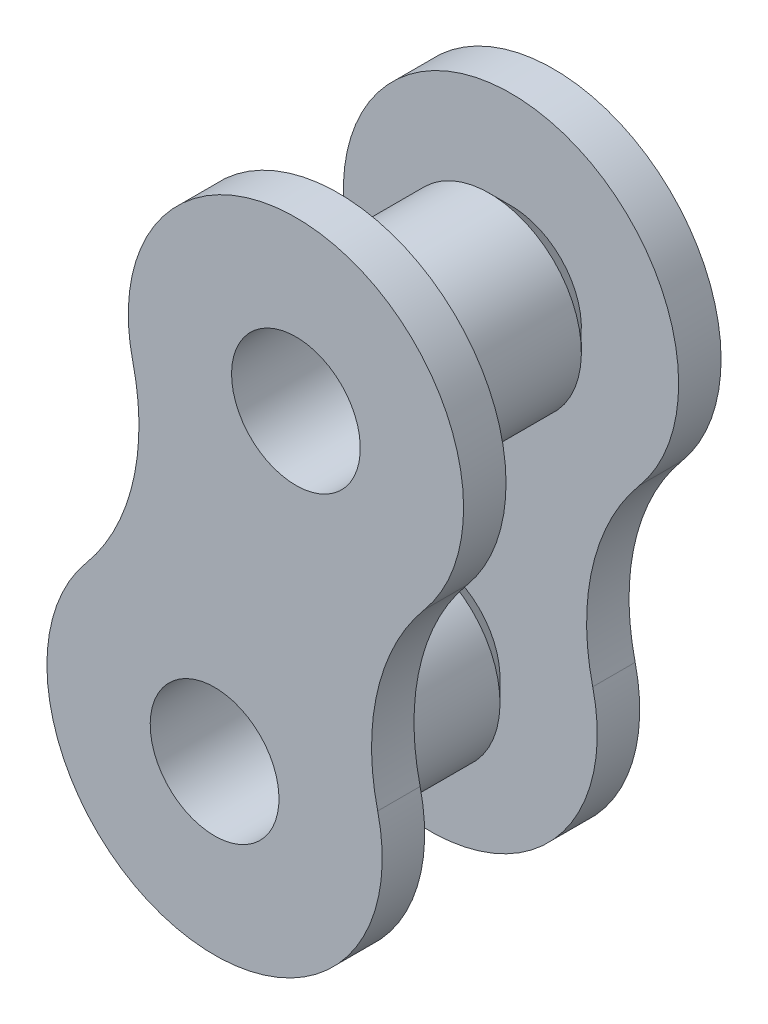
ISO-10303-21;
HEADER;
FILE_DESCRIPTION(('STEP AP214'),'2;1');
FILE_NAME('part.step','',(''),(''),'','','');
FILE_SCHEMA(('AUTOMOTIVE_DESIGN { 1 0 10303 214 1 1 1 1 }'));
ENDSEC;
DATA;
#1=APPLICATION_CONTEXT('core data for automotive mechanical design processes');
#2=APPLICATION_PROTOCOL_DEFINITION('international standard','automotive_design',2000,#1);
#3=PRODUCT_CONTEXT('',#1,'mechanical');
#4=PRODUCT('Part','Part','',(#3));
#5=PRODUCT_RELATED_PRODUCT_CATEGORY('part','',(#4));
#6=PRODUCT_DEFINITION_FORMATION('','',#4);
#7=PRODUCT_DEFINITION_CONTEXT('part definition',#1,'design');
#8=PRODUCT_DEFINITION('design','',#6,#7);
#9=PRODUCT_DEFINITION_SHAPE('','',#8);
#10=(LENGTH_UNIT() NAMED_UNIT(*) SI_UNIT(.MILLI.,.METRE.));
#11=(NAMED_UNIT(*) PLANE_ANGLE_UNIT() SI_UNIT($,.RADIAN.));
#12=(NAMED_UNIT(*) SI_UNIT($,.STERADIAN.) SOLID_ANGLE_UNIT());
#13=UNCERTAINTY_MEASURE_WITH_UNIT(LENGTH_MEASURE(1.E-05),#10,'distance_accuracy_value','');
#14=(GEOMETRIC_REPRESENTATION_CONTEXT(3) GLOBAL_UNCERTAINTY_ASSIGNED_CONTEXT((#13)) GLOBAL_UNIT_ASSIGNED_CONTEXT((#10,
#11,#12)) REPRESENTATION_CONTEXT('',''));
#15=CARTESIAN_POINT('',(0.,0.,0.));
#16=DIRECTION('',(0.,0.,1.));
#17=DIRECTION('',(1.,0.,0.));
#18=AXIS2_PLACEMENT_3D('',#15,#16,#17);
#19=CARTESIAN_POINT('',(132.238252318365,98.738595123789,-128.5494));
#20=DIRECTION('',(0.,0.,-1.));
#21=DIRECTION('',(0.,-1.,0.));
#22=AXIS2_PLACEMENT_3D('',#19,#20,#21);
#23=PLANE('',#22);
#24=CARTESIAN_POINT('',(132.968561423446,101.828461400999,-128.5494));
#25=DIRECTION('',(0.,0.,1.));
#26=DIRECTION('',(-0.230018615773368,-0.973186229042368,0.));
#27=AXIS2_PLACEMENT_3D('',#24,#25,#26);
#28=CIRCLE('',#27,3.0099);
#29=CARTESIAN_POINT('',(135.275481546293,99.8951695045691,-128.5494));
#30=VERTEX_POINT('',#29);
#31=CARTESIAN_POINT('',(130.040214508132,101.132557417987,-128.5494));
#32=VERTEX_POINT('',#31);
#33=EDGE_CURVE('E170',#30,#32,#28,.T.);
#34=ORIENTED_EDGE('',*,*,#33,.T.);
#35=CARTESIAN_POINT('',(126.085696246034,100.192790003445,-128.5494));
#36=DIRECTION('',(0.,0.,1.));
#37=DIRECTION('',(-0.230018615773368,-0.973186229042368,0.));
#38=AXIS2_PLACEMENT_3D('',#35,#36,#37);
#39=CIRCLE('',#38,4.06464973628698);
#40=CARTESIAN_POINT('',(129.201023090437,97.582020743009,-128.5494));
#41=VERTEX_POINT('',#40);
#42=EDGE_CURVE('E168',#41,#32,#39,.T.);
#43=ORIENTED_EDGE('',*,*,#42,.F.);
#44=CARTESIAN_POINT('',(131.507943213285,95.6487288465795,-128.5494));
#45=DIRECTION('',(0.,0.,1.));
#46=DIRECTION('',(-0.230018615773368,-0.973186229042368,0.));
#47=AXIS2_PLACEMENT_3D('',#44,#45,#46);
#48=CIRCLE('',#47,3.0099);
#49=CARTESIAN_POINT('',(134.436290128599,96.344632829591,-128.5494));
#50=VERTEX_POINT('',#49);
#51=EDGE_CURVE('E244',#41,#50,#48,.T.);
#52=ORIENTED_EDGE('',*,*,#51,.T.);
#53=CARTESIAN_POINT('',(138.390808390696,97.2844002441326,-128.5494));
#54=DIRECTION('',(0.,0.,1.));
#55=DIRECTION('',(-0.230018615773368,-0.973186229042368,0.));
#56=AXIS2_PLACEMENT_3D('',#53,#54,#55);
#57=CIRCLE('',#56,4.06464973628691);
#58=EDGE_CURVE('E26',#30,#50,#57,.T.);
#59=ORIENTED_EDGE('',*,*,#58,.F.);
#60=EDGE_LOOP('',(#34,#43,#52,#59));
#61=FACE_BOUND('',#60,.T.);
#62=CARTESIAN_POINT('',(131.507943213285,95.6487288465795,-128.5494));
#63=DIRECTION('',(0.,0.,1.));
#64=DIRECTION('',(-0.230018615773368,-0.973186229042368,0.));
#65=AXIS2_PLACEMENT_3D('',#62,#63,#64);
#66=CIRCLE('',#65,1.26365);
#67=CARTESIAN_POINT('',(131.217280189463,94.4189620682501,-128.5494));
#68=VERTEX_POINT('',#67);
#69=EDGE_CURVE('E175',#68,#68,#66,.T.);
#70=ORIENTED_EDGE('',*,*,#69,.F.);
#71=EDGE_LOOP('',(#70));
#72=FACE_BOUND('',#71,.T.);
#73=CARTESIAN_POINT('',(132.968561423446,101.828461400999,-128.5494));
#74=DIRECTION('',(0.,0.,1.));
#75=DIRECTION('',(-0.230018615773368,-0.973186229042368,0.));
#76=AXIS2_PLACEMENT_3D('',#73,#74,#75);
#77=CIRCLE('',#76,1.26365);
#78=CARTESIAN_POINT('',(132.677898399624,100.598694622669,-128.5494));
#79=VERTEX_POINT('',#78);
#80=EDGE_CURVE('E231',#79,#79,#77,.T.);
#81=ORIENTED_EDGE('',*,*,#80,.F.);
#82=EDGE_LOOP('',(#81));
#83=FACE_BOUND('',#82,.T.);
#84=ADVANCED_FACE('F17',(#61,#72,#83),#23,.F.);
#85=CARTESIAN_POINT('',(132.238252318365,98.738595123789,-129.3114));
#86=DIRECTION('',(0.,0.,-1.));
#87=DIRECTION('',(0.,-1.,0.));
#88=AXIS2_PLACEMENT_3D('',#85,#86,#87);
#89=PLANE('',#88);
#90=CARTESIAN_POINT('',(132.968561423446,101.828461400999,-129.3114));
#91=DIRECTION('',(0.,0.,1.));
#92=DIRECTION('',(-0.230018615773368,-0.973186229042368,0.));
#93=AXIS2_PLACEMENT_3D('',#90,#91,#92);
#94=CIRCLE('',#93,1.1557);
#95=CARTESIAN_POINT('',(132.702728909196,100.703750076094,-129.3114));
#96=VERTEX_POINT('',#95);
#97=EDGE_CURVE('E278',#96,#96,#94,.T.);
#98=ORIENTED_EDGE('',*,*,#97,.T.);
#99=EDGE_LOOP('',(#98));
#100=FACE_BOUND('',#99,.T.);
#101=CARTESIAN_POINT('',(131.507943213285,95.6487288465795,-129.3114));
#102=DIRECTION('',(0.,0.,1.));
#103=DIRECTION('',(-0.230018615773368,-0.973186229042368,0.));
#104=AXIS2_PLACEMENT_3D('',#101,#102,#103);
#105=CIRCLE('',#104,1.1557);
#106=CARTESIAN_POINT('',(131.242110699035,94.5240175216752,-129.3114));
#107=VERTEX_POINT('',#106);
#108=EDGE_CURVE('E160',#107,#107,#105,.T.);
#109=ORIENTED_EDGE('',*,*,#108,.T.);
#110=EDGE_LOOP('',(#109));
#111=FACE_BOUND('',#110,.T.);
#112=CARTESIAN_POINT('',(132.968561423446,101.828461400999,-129.3114));
#113=DIRECTION('',(0.,0.,1.));
#114=DIRECTION('',(-0.230018615773368,-0.973186229042368,0.));
#115=AXIS2_PLACEMENT_3D('',#112,#113,#114);
#116=CIRCLE('',#115,3.0099);
#117=CARTESIAN_POINT('',(135.275481546293,99.8951695045691,-129.3114));
#118=VERTEX_POINT('',#117);
#119=CARTESIAN_POINT('',(130.040214508132,101.132557417987,-129.3114));
#120=VERTEX_POINT('',#119);
#121=EDGE_CURVE('E169',#118,#120,#116,.T.);
#122=ORIENTED_EDGE('',*,*,#121,.F.);
#123=CARTESIAN_POINT('',(138.390808390696,97.2844002441326,-129.3114));
#124=DIRECTION('',(0.,0.,1.));
#125=DIRECTION('',(-0.230018615773368,-0.973186229042368,0.));
#126=AXIS2_PLACEMENT_3D('',#123,#124,#125);
#127=CIRCLE('',#126,4.06464973628691);
#128=CARTESIAN_POINT('',(134.436290128599,96.344632829591,-129.3114));
#129=VERTEX_POINT('',#128);
#130=EDGE_CURVE('E11',#118,#129,#127,.T.);
#131=ORIENTED_EDGE('',*,*,#130,.T.);
#132=CARTESIAN_POINT('',(131.507943213285,95.6487288465795,-129.3114));
#133=DIRECTION('',(0.,0.,1.));
#134=DIRECTION('',(-0.230018615773368,-0.973186229042368,0.));
#135=AXIS2_PLACEMENT_3D('',#132,#133,#134);
#136=CIRCLE('',#135,3.0099);
#137=CARTESIAN_POINT('',(129.201023090437,97.582020743009,-129.3114));
#138=VERTEX_POINT('',#137);
#139=EDGE_CURVE('E248',#138,#129,#136,.T.);
#140=ORIENTED_EDGE('',*,*,#139,.F.);
#141=CARTESIAN_POINT('',(126.085696246034,100.192790003445,-129.3114));
#142=DIRECTION('',(0.,0.,1.));
#143=DIRECTION('',(-0.230018615773368,-0.973186229042368,0.));
#144=AXIS2_PLACEMENT_3D('',#141,#142,#143);
#145=CIRCLE('',#144,4.06464973628698);
#146=EDGE_CURVE('E200',#138,#120,#145,.T.);
#147=ORIENTED_EDGE('',*,*,#146,.T.);
#148=EDGE_LOOP('',(#122,#131,#140,#147));
#149=FACE_BOUND('',#148,.T.);
#150=ADVANCED_FACE('F19',(#100,#111,#149),#89,.T.);
#151=CARTESIAN_POINT('',(138.390808390696,97.2844002441326,-129.3114));
#152=DIRECTION('',(0.,0.,1.));
#153=DIRECTION('',(0.230018615773368,0.973186229042368,0.));
#154=AXIS2_PLACEMENT_3D('',#151,#152,#153);
#155=CYLINDRICAL_SURFACE('',#154,4.06464973628691);
#156=ORIENTED_EDGE('',*,*,#58,.T.);
#157=DIRECTION('',(0.,0.,1.));
#158=VECTOR('',#157,1.);
#159=CARTESIAN_POINT('',(134.436290128599,96.344632829591,-129.3114));
#160=LINE('',#159,#158);
#161=EDGE_CURVE('E199',#129,#50,#160,.T.);
#162=ORIENTED_EDGE('',*,*,#161,.F.);
#163=ORIENTED_EDGE('',*,*,#130,.F.);
#164=DIRECTION('',(0.,0.,1.));
#165=VECTOR('',#164,1.);
#166=CARTESIAN_POINT('',(135.275481546293,99.8951695045691,-129.3114));
#167=LINE('',#166,#165);
#168=EDGE_CURVE('E174',#118,#30,#167,.T.);
#169=ORIENTED_EDGE('',*,*,#168,.T.);
#170=EDGE_LOOP('',(#156,#162,#163,#169));
#171=FACE_BOUND('',#170,.T.);
#172=ADVANCED_FACE('F268',(#171),#155,.F.);
#173=CARTESIAN_POINT('',(131.507943213285,95.6487288465795,-129.3114));
#174=DIRECTION('',(0.,0.,1.));
#175=DIRECTION('',(0.230018615773368,0.973186229042368,0.));
#176=AXIS2_PLACEMENT_3D('',#173,#174,#175);
#177=CYLINDRICAL_SURFACE('',#176,3.0099);
#178=ORIENTED_EDGE('',*,*,#51,.F.);
#179=DIRECTION('',(0.,0.,1.));
#180=VECTOR('',#179,1.);
#181=CARTESIAN_POINT('',(129.201023090437,97.582020743009,-129.3114));
#182=LINE('',#181,#180);
#183=EDGE_CURVE('E203',#138,#41,#182,.T.);
#184=ORIENTED_EDGE('',*,*,#183,.F.);
#185=ORIENTED_EDGE('',*,*,#139,.T.);
#186=ORIENTED_EDGE('',*,*,#161,.T.);
#187=EDGE_LOOP('',(#178,#184,#185,#186));
#188=FACE_BOUND('',#187,.T.);
#189=ADVANCED_FACE('F254',(#188),#177,.T.);
#190=CARTESIAN_POINT('',(126.085696246034,100.192790003445,-129.3114));
#191=DIRECTION('',(0.,0.,1.));
#192=DIRECTION('',(0.230018615773368,0.973186229042368,0.));
#193=AXIS2_PLACEMENT_3D('',#190,#191,#192);
#194=CYLINDRICAL_SURFACE('',#193,4.06464973628698);
#195=ORIENTED_EDGE('',*,*,#42,.T.);
#196=DIRECTION('',(0.,0.,1.));
#197=VECTOR('',#196,1.);
#198=CARTESIAN_POINT('',(130.040214508132,101.132557417987,-129.3114));
#199=LINE('',#198,#197);
#200=EDGE_CURVE('E165',#120,#32,#199,.T.);
#201=ORIENTED_EDGE('',*,*,#200,.F.);
#202=ORIENTED_EDGE('',*,*,#146,.F.);
#203=ORIENTED_EDGE('',*,*,#183,.T.);
#204=EDGE_LOOP('',(#195,#201,#202,#203));
#205=FACE_BOUND('',#204,.T.);
#206=ADVANCED_FACE('F262',(#205),#194,.F.);
#207=CARTESIAN_POINT('',(132.968561423446,101.828461400999,-129.3114));
#208=DIRECTION('',(0.,0.,1.));
#209=DIRECTION('',(0.230018615773368,0.973186229042368,0.));
#210=AXIS2_PLACEMENT_3D('',#207,#208,#209);
#211=CYLINDRICAL_SURFACE('',#210,3.0099);
#212=ORIENTED_EDGE('',*,*,#33,.F.);
#213=ORIENTED_EDGE('',*,*,#168,.F.);
#214=ORIENTED_EDGE('',*,*,#121,.T.);
#215=ORIENTED_EDGE('',*,*,#200,.T.);
#216=EDGE_LOOP('',(#212,#213,#214,#215));
#217=FACE_BOUND('',#216,.T.);
#218=ADVANCED_FACE('F265',(#217),#211,.T.);
#219=CARTESIAN_POINT('',(131.507943213285,95.6487288465795,-128.5494));
#220=DIRECTION('',(0.,0.,1.));
#221=DIRECTION('',(0.230018615773368,0.973186229042368,0.));
#222=AXIS2_PLACEMENT_3D('',#219,#220,#221);
#223=CONICAL_SURFACE('',#222,1.26365,0.785398163397448);
#224=ORIENTED_EDGE('',*,*,#69,.T.);
#225=EDGE_LOOP('',(#224));
#226=FACE_BOUND('',#225,.T.);
#227=CARTESIAN_POINT('',(131.507943213285,95.6487288465795,-128.16205));
#228=DIRECTION('',(0.,0.,-1.));
#229=DIRECTION('',(-0.230018615773368,-0.973186229042368,0.));
#230=AXIS2_PLACEMENT_3D('',#227,#228,#229);
#231=CIRCLE('',#230,1.651);
#232=CARTESIAN_POINT('',(131.128182478643,94.0419983824305,-128.16205));
#233=VERTEX_POINT('',#232);
#234=EDGE_CURVE('E187',#233,#233,#231,.T.);
#235=ORIENTED_EDGE('',*,*,#234,.T.);
#236=EDGE_LOOP('',(#235));
#237=FACE_BOUND('',#236,.T.);
#238=ADVANCED_FACE('F373',(#226,#237),#223,.T.);
#239=CARTESIAN_POINT('',(132.968561423446,101.828461400999,-128.5494));
#240=DIRECTION('',(0.,0.,1.));
#241=DIRECTION('',(0.230018615773368,0.973186229042368,0.));
#242=AXIS2_PLACEMENT_3D('',#239,#240,#241);
#243=CONICAL_SURFACE('',#242,1.26365,0.785398163397448);
#244=ORIENTED_EDGE('',*,*,#80,.T.);
#245=EDGE_LOOP('',(#244));
#246=FACE_BOUND('',#245,.T.);
#247=CARTESIAN_POINT('',(132.968561423446,101.828461400999,-128.16205));
#248=DIRECTION('',(0.,0.,-1.));
#249=DIRECTION('',(-0.230018615773368,-0.973186229042368,0.));
#250=AXIS2_PLACEMENT_3D('',#247,#248,#249);
#251=CIRCLE('',#250,1.651);
#252=CARTESIAN_POINT('',(132.588800688804,100.22173093685,-128.16205));
#253=VERTEX_POINT('',#252);
#254=EDGE_CURVE('E154',#253,#253,#251,.T.);
#255=ORIENTED_EDGE('',*,*,#254,.T.);
#256=EDGE_LOOP('',(#255));
#257=FACE_BOUND('',#256,.T.);
#258=ADVANCED_FACE('F370',(#246,#257),#243,.T.);
#259=CARTESIAN_POINT('',(132.238252318365,98.738595123789,-125.4506));
#260=DIRECTION('',(0.,0.,1.));
#261=DIRECTION('',(1.,0.,0.));
#262=AXIS2_PLACEMENT_3D('',#259,#260,#261);
#263=PLANE('',#262);
#264=CARTESIAN_POINT('',(132.968561423446,101.828461400999,-125.4506));
#265=DIRECTION('',(0.,0.,1.));
#266=DIRECTION('',(-0.230018615773368,-0.973186229042368,0.));
#267=AXIS2_PLACEMENT_3D('',#264,#265,#266);
#268=CIRCLE('',#267,3.0099);
#269=CARTESIAN_POINT('',(135.275481546293,99.8951695045691,-125.4506));
#270=VERTEX_POINT('',#269);
#271=CARTESIAN_POINT('',(130.040214508132,101.132557417987,-125.4506));
#272=VERTEX_POINT('',#271);
#273=EDGE_CURVE('E207',#270,#272,#268,.T.);
#274=ORIENTED_EDGE('',*,*,#273,.F.);
#275=CARTESIAN_POINT('',(138.390808390696,97.2844002441326,-125.4506));
#276=DIRECTION('',(0.,0.,1.));
#277=DIRECTION('',(-0.230018615773368,-0.973186229042368,0.));
#278=AXIS2_PLACEMENT_3D('',#275,#276,#277);
#279=CIRCLE('',#278,4.06464973628691);
#280=CARTESIAN_POINT('',(134.436290128599,96.344632829591,-125.4506));
#281=VERTEX_POINT('',#280);
#282=EDGE_CURVE('E225',#270,#281,#279,.T.);
#283=ORIENTED_EDGE('',*,*,#282,.T.);
#284=CARTESIAN_POINT('',(131.507943213285,95.6487288465795,-125.4506));
#285=DIRECTION('',(0.,0.,1.));
#286=DIRECTION('',(-0.230018615773368,-0.973186229042368,0.));
#287=AXIS2_PLACEMENT_3D('',#284,#285,#286);
#288=CIRCLE('',#287,3.0099);
#289=CARTESIAN_POINT('',(129.201023090437,97.582020743009,-125.4506));
#290=VERTEX_POINT('',#289);
#291=EDGE_CURVE('E213',#290,#281,#288,.T.);
#292=ORIENTED_EDGE('',*,*,#291,.F.);
#293=CARTESIAN_POINT('',(126.085696246034,100.192790003445,-125.4506));
#294=DIRECTION('',(0.,0.,1.));
#295=DIRECTION('',(-0.230018615773368,-0.973186229042368,0.));
#296=AXIS2_PLACEMENT_3D('',#293,#294,#295);
#297=CIRCLE('',#296,4.06464973628698);
#298=EDGE_CURVE('E184',#290,#272,#297,.T.);
#299=ORIENTED_EDGE('',*,*,#298,.T.);
#300=EDGE_LOOP('',(#274,#283,#292,#299));
#301=FACE_BOUND('',#300,.T.);
#302=CARTESIAN_POINT('',(131.507943213285,95.6487288465795,-125.4506));
#303=DIRECTION('',(0.,0.,1.));
#304=DIRECTION('',(-0.230018615773368,-0.973186229042368,0.));
#305=AXIS2_PLACEMENT_3D('',#302,#303,#304);
#306=CIRCLE('',#305,1.26365);
#307=CARTESIAN_POINT('',(131.217280189463,94.4189620682501,-125.4506));
#308=VERTEX_POINT('',#307);
#309=EDGE_CURVE('E190',#308,#308,#306,.T.);
#310=ORIENTED_EDGE('',*,*,#309,.T.);
#311=EDGE_LOOP('',(#310));
#312=FACE_BOUND('',#311,.T.);
#313=CARTESIAN_POINT('',(132.968561423446,101.828461400999,-125.4506));
#314=DIRECTION('',(0.,0.,1.));
#315=DIRECTION('',(-0.230018615773368,-0.973186229042368,0.));
#316=AXIS2_PLACEMENT_3D('',#313,#314,#315);
#317=CIRCLE('',#316,1.26365);
#318=CARTESIAN_POINT('',(132.677898399624,100.598694622669,-125.4506));
#319=VERTEX_POINT('',#318);
#320=EDGE_CURVE('E149',#319,#319,#317,.T.);
#321=ORIENTED_EDGE('',*,*,#320,.T.);
#322=EDGE_LOOP('',(#321));
#323=FACE_BOUND('',#322,.T.);
#324=ADVANCED_FACE('F150',(#301,#312,#323),#263,.F.);
#325=CARTESIAN_POINT('',(132.238252318365,98.738595123789,-124.6886));
#326=DIRECTION('',(0.,0.,1.));
#327=DIRECTION('',(1.,0.,0.));
#328=AXIS2_PLACEMENT_3D('',#325,#326,#327);
#329=PLANE('',#328);
#330=CARTESIAN_POINT('',(132.968561423446,101.828461400999,-124.6886));
#331=DIRECTION('',(0.,0.,1.));
#332=DIRECTION('',(-0.230018615773368,-0.973186229042368,0.));
#333=AXIS2_PLACEMENT_3D('',#330,#331,#332);
#334=CIRCLE('',#333,1.1557);
#335=CARTESIAN_POINT('',(132.702728909196,100.703750076094,-124.6886));
#336=VERTEX_POINT('',#335);
#337=EDGE_CURVE('E323',#336,#336,#334,.T.);
#338=ORIENTED_EDGE('',*,*,#337,.F.);
#339=EDGE_LOOP('',(#338));
#340=FACE_BOUND('',#339,.T.);
#341=CARTESIAN_POINT('',(131.507943213285,95.6487288465795,-124.6886));
#342=DIRECTION('',(0.,0.,1.));
#343=DIRECTION('',(-0.230018615773368,-0.973186229042368,0.));
#344=AXIS2_PLACEMENT_3D('',#341,#342,#343);
#345=CIRCLE('',#344,1.1557);
#346=CARTESIAN_POINT('',(131.242110699035,94.5240175216752,-124.6886));
#347=VERTEX_POINT('',#346);
#348=EDGE_CURVE('E153',#347,#347,#345,.T.);
#349=ORIENTED_EDGE('',*,*,#348,.F.);
#350=EDGE_LOOP('',(#349));
#351=FACE_BOUND('',#350,.T.);
#352=CARTESIAN_POINT('',(132.968561423446,101.828461400999,-124.6886));
#353=DIRECTION('',(0.,0.,1.));
#354=DIRECTION('',(-0.230018615773368,-0.973186229042368,0.));
#355=AXIS2_PLACEMENT_3D('',#352,#353,#354);
#356=CIRCLE('',#355,3.0099);
#357=CARTESIAN_POINT('',(135.275481546293,99.8951695045691,-124.6886));
#358=VERTEX_POINT('',#357);
#359=CARTESIAN_POINT('',(130.040214508132,101.132557417987,-124.6886));
#360=VERTEX_POINT('',#359);
#361=EDGE_CURVE('E191',#358,#360,#356,.T.);
#362=ORIENTED_EDGE('',*,*,#361,.T.);
#363=CARTESIAN_POINT('',(126.085696246034,100.192790003445,-124.6886));
#364=DIRECTION('',(0.,0.,1.));
#365=DIRECTION('',(-0.230018615773368,-0.973186229042368,0.));
#366=AXIS2_PLACEMENT_3D('',#363,#364,#365);
#367=CIRCLE('',#366,4.06464973628698);
#368=CARTESIAN_POINT('',(129.201023090437,97.582020743009,-124.6886));
#369=VERTEX_POINT('',#368);
#370=EDGE_CURVE('E183',#369,#360,#367,.T.);
#371=ORIENTED_EDGE('',*,*,#370,.F.);
#372=CARTESIAN_POINT('',(131.507943213285,95.6487288465795,-124.6886));
#373=DIRECTION('',(0.,0.,1.));
#374=DIRECTION('',(-0.230018615773368,-0.973186229042368,0.));
#375=AXIS2_PLACEMENT_3D('',#372,#373,#374);
#376=CIRCLE('',#375,3.0099);
#377=CARTESIAN_POINT('',(134.436290128599,96.344632829591,-124.6886));
#378=VERTEX_POINT('',#377);
#379=EDGE_CURVE('E221',#369,#378,#376,.T.);
#380=ORIENTED_EDGE('',*,*,#379,.T.);
#381=CARTESIAN_POINT('',(138.390808390696,97.2844002441326,-124.6886));
#382=DIRECTION('',(0.,0.,1.));
#383=DIRECTION('',(-0.230018615773368,-0.973186229042368,0.));
#384=AXIS2_PLACEMENT_3D('',#381,#382,#383);
#385=CIRCLE('',#384,4.06464973628691);
#386=EDGE_CURVE('E228',#358,#378,#385,.T.);
#387=ORIENTED_EDGE('',*,*,#386,.F.);
#388=EDGE_LOOP('',(#362,#371,#380,#387));
#389=FACE_BOUND('',#388,.T.);
#390=ADVANCED_FACE('F289',(#340,#351,#389),#329,.T.);
#391=CARTESIAN_POINT('',(138.390808390696,97.2844002441326,-124.6886));
#392=DIRECTION('',(0.,0.,-1.));
#393=DIRECTION('',(0.230018615773368,0.973186229042368,0.));
#394=AXIS2_PLACEMENT_3D('',#391,#392,#393);
#395=CYLINDRICAL_SURFACE('',#394,4.06464973628691);
#396=ORIENTED_EDGE('',*,*,#282,.F.);
#397=DIRECTION('',(0.,0.,-1.));
#398=VECTOR('',#397,1.);
#399=CARTESIAN_POINT('',(135.275481546293,99.8951695045691,-124.6886));
#400=LINE('',#399,#398);
#401=EDGE_CURVE('E195',#358,#270,#400,.T.);
#402=ORIENTED_EDGE('',*,*,#401,.F.);
#403=ORIENTED_EDGE('',*,*,#386,.T.);
#404=DIRECTION('',(0.,0.,-1.));
#405=VECTOR('',#404,1.);
#406=CARTESIAN_POINT('',(134.436290128599,96.344632829591,-124.6886));
#407=LINE('',#406,#405);
#408=EDGE_CURVE('E217',#378,#281,#407,.T.);
#409=ORIENTED_EDGE('',*,*,#408,.T.);
#410=EDGE_LOOP('',(#396,#402,#403,#409));
#411=FACE_BOUND('',#410,.T.);
#412=ADVANCED_FACE('F292',(#411),#395,.F.);
#413=CARTESIAN_POINT('',(131.507943213285,95.6487288465795,-124.6886));
#414=DIRECTION('',(0.,0.,-1.));
#415=DIRECTION('',(0.230018615773368,0.973186229042368,0.));
#416=AXIS2_PLACEMENT_3D('',#413,#414,#415);
#417=CYLINDRICAL_SURFACE('',#416,3.0099);
#418=ORIENTED_EDGE('',*,*,#291,.T.);
#419=ORIENTED_EDGE('',*,*,#408,.F.);
#420=ORIENTED_EDGE('',*,*,#379,.F.);
#421=DIRECTION('',(0.,0.,-1.));
#422=VECTOR('',#421,1.);
#423=CARTESIAN_POINT('',(129.201023090437,97.582020743009,-124.6886));
#424=LINE('',#423,#422);
#425=EDGE_CURVE('E179',#369,#290,#424,.T.);
#426=ORIENTED_EDGE('',*,*,#425,.T.);
#427=EDGE_LOOP('',(#418,#419,#420,#426));
#428=FACE_BOUND('',#427,.T.);
#429=ADVANCED_FACE('F308',(#428),#417,.T.);
#430=CARTESIAN_POINT('',(126.085696246034,100.192790003445,-124.6886));
#431=DIRECTION('',(0.,0.,-1.));
#432=DIRECTION('',(0.230018615773368,0.973186229042368,0.));
#433=AXIS2_PLACEMENT_3D('',#430,#431,#432);
#434=CYLINDRICAL_SURFACE('',#433,4.06464973628698);
#435=ORIENTED_EDGE('',*,*,#298,.F.);
#436=ORIENTED_EDGE('',*,*,#425,.F.);
#437=ORIENTED_EDGE('',*,*,#370,.T.);
#438=DIRECTION('',(0.,0.,-1.));
#439=VECTOR('',#438,1.);
#440=CARTESIAN_POINT('',(130.040214508132,101.132557417987,-124.6886));
#441=LINE('',#440,#439);
#442=EDGE_CURVE('E196',#360,#272,#441,.T.);
#443=ORIENTED_EDGE('',*,*,#442,.T.);
#444=EDGE_LOOP('',(#435,#436,#437,#443));
#445=FACE_BOUND('',#444,.T.);
#446=ADVANCED_FACE('F306',(#445),#434,.F.);
#447=CARTESIAN_POINT('',(132.968561423446,101.828461400999,-124.6886));
#448=DIRECTION('',(0.,0.,-1.));
#449=DIRECTION('',(0.230018615773368,0.973186229042368,0.));
#450=AXIS2_PLACEMENT_3D('',#447,#448,#449);
#451=CYLINDRICAL_SURFACE('',#450,3.0099);
#452=ORIENTED_EDGE('',*,*,#273,.T.);
#453=ORIENTED_EDGE('',*,*,#442,.F.);
#454=ORIENTED_EDGE('',*,*,#361,.F.);
#455=ORIENTED_EDGE('',*,*,#401,.T.);
#456=EDGE_LOOP('',(#452,#453,#454,#455));
#457=FACE_BOUND('',#456,.T.);
#458=ADVANCED_FACE('F302',(#457),#451,.T.);
#459=CARTESIAN_POINT('',(131.507943213285,95.6487288465795,-125.4506));
#460=DIRECTION('',(0.,0.,-1.));
#461=DIRECTION('',(0.230018615773368,0.973186229042368,0.));
#462=AXIS2_PLACEMENT_3D('',#459,#460,#461);
#463=CONICAL_SURFACE('',#462,1.26365,0.785398163397448);
#464=ORIENTED_EDGE('',*,*,#309,.F.);
#465=EDGE_LOOP('',(#464));
#466=FACE_BOUND('',#465,.T.);
#467=CARTESIAN_POINT('',(131.507943213285,95.6487288465795,-125.83795));
#468=DIRECTION('',(0.,0.,-1.));
#469=DIRECTION('',(-0.230018615773368,-0.973186229042368,0.));
#470=AXIS2_PLACEMENT_3D('',#467,#468,#469);
#471=CIRCLE('',#470,1.651);
#472=CARTESIAN_POINT('',(131.128182478643,94.0419983824305,-125.83795));
#473=VERTEX_POINT('',#472);
#474=EDGE_CURVE('E178',#473,#473,#471,.T.);
#475=ORIENTED_EDGE('',*,*,#474,.F.);
#476=EDGE_LOOP('',(#475));
#477=FACE_BOUND('',#476,.T.);
#478=ADVANCED_FACE('F357',(#466,#477),#463,.T.);
#479=CARTESIAN_POINT('',(131.507943213285,95.6487288465795,-125.4506));
#480=DIRECTION('',(0.,0.,-1.));
#481=DIRECTION('',(0.230018615773368,0.973186229042368,0.));
#482=AXIS2_PLACEMENT_3D('',#479,#480,#481);
#483=CYLINDRICAL_SURFACE('',#482,1.651);
#484=ORIENTED_EDGE('',*,*,#234,.F.);
#485=EDGE_LOOP('',(#484));
#486=FACE_BOUND('',#485,.T.);
#487=ORIENTED_EDGE('',*,*,#474,.T.);
#488=EDGE_LOOP('',(#487));
#489=FACE_BOUND('',#488,.T.);
#490=ADVANCED_FACE('F285',(#486,#489),#483,.T.);
#491=CARTESIAN_POINT('',(131.507943213285,95.6487288465795,-125.4506));
#492=DIRECTION('',(0.,0.,-1.));
#493=DIRECTION('',(0.230018615773368,0.973186229042368,0.));
#494=AXIS2_PLACEMENT_3D('',#491,#492,#493);
#495=CYLINDRICAL_SURFACE('',#494,1.1557);
#496=ORIENTED_EDGE('',*,*,#108,.F.);
#497=EDGE_LOOP('',(#496));
#498=FACE_BOUND('',#497,.T.);
#499=ORIENTED_EDGE('',*,*,#348,.T.);
#500=EDGE_LOOP('',(#499));
#501=FACE_BOUND('',#500,.T.);
#502=ADVANCED_FACE('F281',(#498,#501),#495,.F.);
#503=CARTESIAN_POINT('',(132.968561423446,101.828461400999,-125.4506));
#504=DIRECTION('',(0.,0.,-1.));
#505=DIRECTION('',(0.230018615773368,0.973186229042368,0.));
#506=AXIS2_PLACEMENT_3D('',#503,#504,#505);
#507=CONICAL_SURFACE('',#506,1.26365,0.785398163397448);
#508=ORIENTED_EDGE('',*,*,#320,.F.);
#509=EDGE_LOOP('',(#508));
#510=FACE_BOUND('',#509,.T.);
#511=CARTESIAN_POINT('',(132.968561423446,101.828461400999,-125.83795));
#512=DIRECTION('',(0.,0.,-1.));
#513=DIRECTION('',(-0.230018615773368,-0.973186229042368,0.));
#514=AXIS2_PLACEMENT_3D('',#511,#512,#513);
#515=CIRCLE('',#514,1.651);
#516=CARTESIAN_POINT('',(132.588800688804,100.22173093685,-125.83795));
#517=VERTEX_POINT('',#516);
#518=EDGE_CURVE('E162',#517,#517,#515,.T.);
#519=ORIENTED_EDGE('',*,*,#518,.F.);
#520=EDGE_LOOP('',(#519));
#521=FACE_BOUND('',#520,.T.);
#522=ADVANCED_FACE('F284',(#510,#521),#507,.T.);
#523=CARTESIAN_POINT('',(132.968561423446,101.828461400999,-125.4506));
#524=DIRECTION('',(0.,0.,-1.));
#525=DIRECTION('',(0.230018615773368,0.973186229042368,0.));
#526=AXIS2_PLACEMENT_3D('',#523,#524,#525);
#527=CYLINDRICAL_SURFACE('',#526,1.651);
#528=ORIENTED_EDGE('',*,*,#254,.F.);
#529=EDGE_LOOP('',(#528));
#530=FACE_BOUND('',#529,.T.);
#531=ORIENTED_EDGE('',*,*,#518,.T.);
#532=EDGE_LOOP('',(#531));
#533=FACE_BOUND('',#532,.T.);
#534=ADVANCED_FACE('F340',(#530,#533),#527,.T.);
#535=CARTESIAN_POINT('',(132.968561423446,101.828461400999,-125.4506));
#536=DIRECTION('',(0.,0.,-1.));
#537=DIRECTION('',(0.230018615773368,0.973186229042368,0.));
#538=AXIS2_PLACEMENT_3D('',#535,#536,#537);
#539=CYLINDRICAL_SURFACE('',#538,1.1557);
#540=ORIENTED_EDGE('',*,*,#97,.F.);
#541=EDGE_LOOP('',(#540));
#542=FACE_BOUND('',#541,.T.);
#543=ORIENTED_EDGE('',*,*,#337,.T.);
#544=EDGE_LOOP('',(#543));
#545=FACE_BOUND('',#544,.T.);
#546=ADVANCED_FACE('F338',(#542,#545),#539,.F.);
#547=CLOSED_SHELL('',(#84,#150,#172,#189,#206,#218,#238,#258,#324,#390,#412,#429,#446,#458,#478,
#490,#502,#522,#534,#546));
#548=MANIFOLD_SOLID_BREP('B1',#547);
#549=ADVANCED_BREP_SHAPE_REPRESENTATION('',(#18,#548),#14);
#550=SHAPE_DEFINITION_REPRESENTATION(#9,#549);
ENDSEC;
END-ISO-10303-21;
